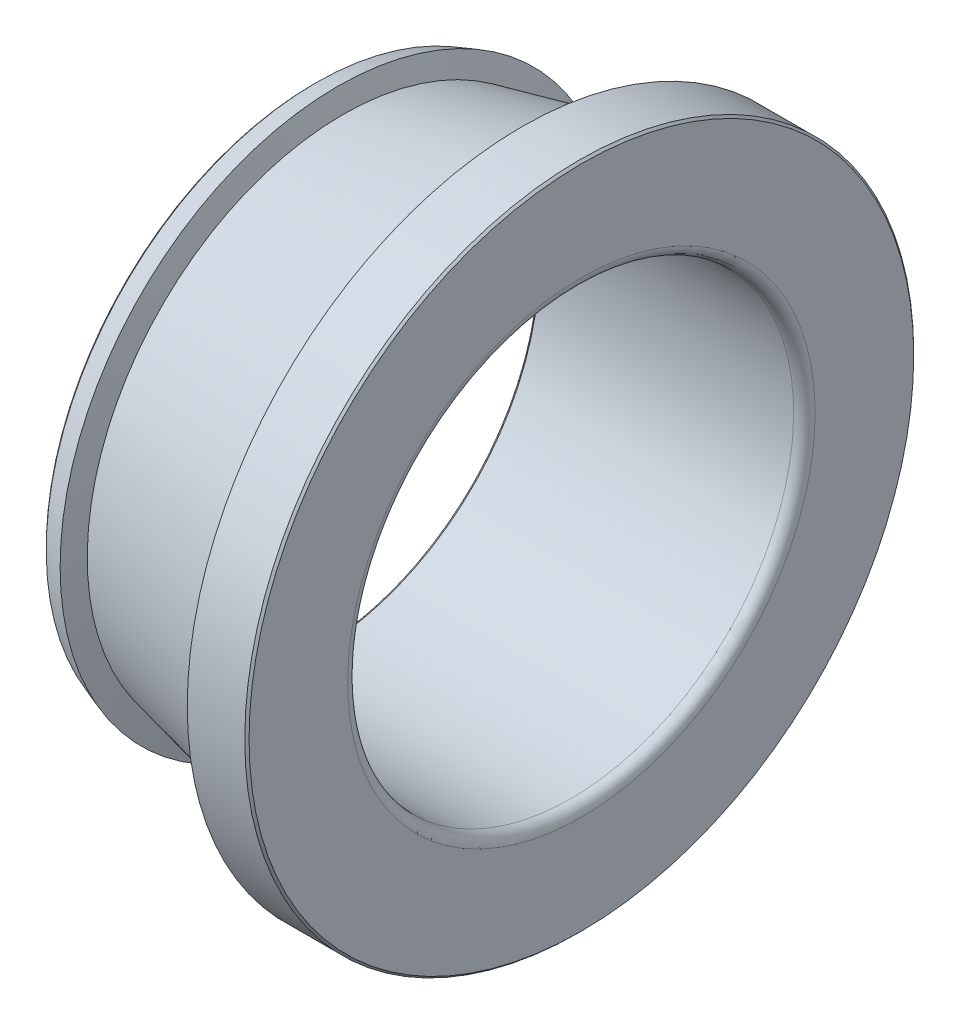
ISO-10303-21;
HEADER;
FILE_DESCRIPTION(('STEP AP214'),'2;1');
FILE_NAME('part.step','',(''),(''),'','','');
FILE_SCHEMA(('AUTOMOTIVE_DESIGN { 1 0 10303 214 1 1 1 1 }'));
ENDSEC;
DATA;
#1=APPLICATION_CONTEXT('core data for automotive mechanical design processes');
#2=APPLICATION_PROTOCOL_DEFINITION('international standard','automotive_design',2000,#1);
#3=PRODUCT_CONTEXT('',#1,'mechanical');
#4=PRODUCT('Part','Part','',(#3));
#5=PRODUCT_RELATED_PRODUCT_CATEGORY('part','',(#4));
#6=PRODUCT_DEFINITION_FORMATION('','',#4);
#7=PRODUCT_DEFINITION_CONTEXT('part definition',#1,'design');
#8=PRODUCT_DEFINITION('design','',#6,#7);
#9=PRODUCT_DEFINITION_SHAPE('','',#8);
#10=(LENGTH_UNIT() NAMED_UNIT(*) SI_UNIT(.MILLI.,.METRE.));
#11=(NAMED_UNIT(*) PLANE_ANGLE_UNIT() SI_UNIT($,.RADIAN.));
#12=(NAMED_UNIT(*) SI_UNIT($,.STERADIAN.) SOLID_ANGLE_UNIT());
#13=UNCERTAINTY_MEASURE_WITH_UNIT(LENGTH_MEASURE(1.E-05),#10,'distance_accuracy_value','');
#14=(GEOMETRIC_REPRESENTATION_CONTEXT(3) GLOBAL_UNCERTAINTY_ASSIGNED_CONTEXT((#13)) GLOBAL_UNIT_ASSIGNED_CONTEXT((#10,
#11,#12)) REPRESENTATION_CONTEXT('',''));
#15=CARTESIAN_POINT('',(0.,0.,0.));
#16=DIRECTION('',(0.,0.,1.));
#17=DIRECTION('',(1.,0.,0.));
#18=AXIS2_PLACEMENT_3D('',#15,#16,#17);
#19=CARTESIAN_POINT('',(5.235,0.,0.));
#20=DIRECTION('',(1.,0.,0.));
#21=DIRECTION('',(0.,1.,0.));
#22=AXIS2_PLACEMENT_3D('',#19,#20,#21);
#23=CONICAL_SURFACE('',#22,16.935,0.34097895349635);
#24=CARTESIAN_POINT('',(0.12,0.,0.));
#25=DIRECTION('',(1.,0.,0.));
#26=DIRECTION('',(0.,1.,0.));
#27=AXIS2_PLACEMENT_3D('',#24,#25,#26);
#28=CIRCLE('',#27,15.12);
#29=CARTESIAN_POINT('',(0.12,15.12,0.));
#30=VERTEX_POINT('',#29);
#31=EDGE_CURVE('E11',#30,#30,#28,.T.);
#32=ORIENTED_EDGE('',*,*,#31,.T.);
#33=EDGE_LOOP('',(#32));
#34=FACE_BOUND('',#33,.T.);
#35=CARTESIAN_POINT('',(1.32723454688479,0.,0.));
#36=DIRECTION('',(-1.,0.,0.));
#37=DIRECTION('',(0.,1.,0.));
#38=AXIS2_PLACEMENT_3D('',#35,#36,#37);
#39=CIRCLE('',#38,15.5483735488946);
#40=CARTESIAN_POINT('',(1.32723454688479,-15.5483735488946,0.));
#41=VERTEX_POINT('',#40);
#42=EDGE_CURVE('E65',#41,#41,#39,.T.);
#43=ORIENTED_EDGE('',*,*,#42,.T.);
#44=EDGE_LOOP('',(#43));
#45=FACE_BOUND('',#44,.T.);
#46=ADVANCED_FACE('F17',(#34,#45),#23,.T.);
#47=CARTESIAN_POINT('',(0.06,0.,0.));
#48=DIRECTION('',(1.,0.,0.));
#49=DIRECTION('',(0.,1.,0.));
#50=AXIS2_PLACEMENT_3D('',#47,#48,#49);
#51=CONICAL_SURFACE('',#50,15.06,0.785398163397445);
#52=CARTESIAN_POINT('',(0.,0.,0.));
#53=DIRECTION('',(1.,0.,0.));
#54=DIRECTION('',(0.,1.,0.));
#55=AXIS2_PLACEMENT_3D('',#52,#53,#54);
#56=CIRCLE('',#55,15.);
#57=CARTESIAN_POINT('',(0.,15.,0.));
#58=VERTEX_POINT('',#57);
#59=EDGE_CURVE('E20',#58,#58,#56,.T.);
#60=ORIENTED_EDGE('',*,*,#59,.T.);
#61=EDGE_LOOP('',(#60));
#62=FACE_BOUND('',#61,.T.);
#63=ORIENTED_EDGE('',*,*,#31,.F.);
#64=EDGE_LOOP('',(#63));
#65=FACE_BOUND('',#64,.T.);
#66=ADVANCED_FACE('F108',(#62,#65),#51,.T.);
#67=CARTESIAN_POINT('',(0.,13.81,0.));
#68=DIRECTION('',(-1.,0.,0.));
#69=DIRECTION('',(0.,-1.,0.));
#70=AXIS2_PLACEMENT_3D('',#67,#68,#69);
#71=PLANE('',#70);
#72=CARTESIAN_POINT('',(0.,0.,0.));
#73=DIRECTION('',(1.,0.,0.));
#74=DIRECTION('',(0.,1.,0.));
#75=AXIS2_PLACEMENT_3D('',#72,#73,#74);
#76=CIRCLE('',#75,12.62);
#77=CARTESIAN_POINT('',(0.,12.62,0.));
#78=VERTEX_POINT('',#77);
#79=EDGE_CURVE('E49',#78,#78,#76,.T.);
#80=ORIENTED_EDGE('',*,*,#79,.T.);
#81=EDGE_LOOP('',(#80));
#82=FACE_BOUND('',#81,.T.);
#83=ORIENTED_EDGE('',*,*,#59,.F.);
#84=EDGE_LOOP('',(#83));
#85=FACE_BOUND('',#84,.T.);
#86=ADVANCED_FACE('F112',(#82,#85),#71,.T.);
#87=CARTESIAN_POINT('',(0.12,0.,0.));
#88=DIRECTION('',(1.,0.,0.));
#89=DIRECTION('',(0.,0.,-1.));
#90=AXIS2_PLACEMENT_3D('',#87,#88,#89);
#91=TOROIDAL_SURFACE('',#90,12.62,0.12);
#92=CARTESIAN_POINT('',(0.12,0.,0.));
#93=DIRECTION('',(1.,0.,0.));
#94=DIRECTION('',(0.,1.,0.));
#95=AXIS2_PLACEMENT_3D('',#92,#93,#94);
#96=CIRCLE('',#95,12.5);
#97=CARTESIAN_POINT('',(0.12,12.5,0.));
#98=VERTEX_POINT('',#97);
#99=EDGE_CURVE('E54',#98,#98,#96,.T.);
#100=ORIENTED_EDGE('',*,*,#99,.T.);
#101=EDGE_LOOP('',(#100));
#102=FACE_BOUND('',#101,.T.);
#103=ORIENTED_EDGE('',*,*,#79,.F.);
#104=EDGE_LOOP('',(#103));
#105=FACE_BOUND('',#104,.T.);
#106=ADVANCED_FACE('F117',(#102,#105),#91,.T.);
#107=CARTESIAN_POINT('',(7.26,0.,0.));
#108=DIRECTION('',(-1.,0.,0.));
#109=DIRECTION('',(0.,1.,0.));
#110=AXIS2_PLACEMENT_3D('',#107,#108,#109);
#111=CYLINDRICAL_SURFACE('',#110,12.5);
#112=CARTESIAN_POINT('',(14.4,0.,0.));
#113=DIRECTION('',(1.,0.,0.));
#114=DIRECTION('',(0.,1.,0.));
#115=AXIS2_PLACEMENT_3D('',#112,#113,#114);
#116=CIRCLE('',#115,12.5);
#117=CARTESIAN_POINT('',(14.4,12.5,0.));
#118=VERTEX_POINT('',#117);
#119=EDGE_CURVE('E82',#118,#118,#116,.T.);
#120=ORIENTED_EDGE('',*,*,#119,.T.);
#121=EDGE_LOOP('',(#120));
#122=FACE_BOUND('',#121,.T.);
#123=ORIENTED_EDGE('',*,*,#99,.F.);
#124=EDGE_LOOP('',(#123));
#125=FACE_BOUND('',#124,.T.);
#126=ADVANCED_FACE('F123',(#122,#125),#111,.F.);
#127=CARTESIAN_POINT('',(14.4,0.,0.));
#128=DIRECTION('',(1.,0.,0.));
#129=DIRECTION('',(0.,0.,-1.));
#130=AXIS2_PLACEMENT_3D('',#127,#128,#129);
#131=TOROIDAL_SURFACE('',#130,13.1,0.6);
#132=CARTESIAN_POINT('',(15.,0.,0.));
#133=DIRECTION('',(1.,0.,0.));
#134=DIRECTION('',(0.,1.,0.));
#135=AXIS2_PLACEMENT_3D('',#132,#133,#134);
#136=CIRCLE('',#135,13.1);
#137=CARTESIAN_POINT('',(15.,13.1,0.));
#138=VERTEX_POINT('',#137);
#139=EDGE_CURVE('E80',#138,#138,#136,.T.);
#140=ORIENTED_EDGE('',*,*,#139,.T.);
#141=EDGE_LOOP('',(#140));
#142=FACE_BOUND('',#141,.T.);
#143=ORIENTED_EDGE('',*,*,#119,.F.);
#144=EDGE_LOOP('',(#143));
#145=FACE_BOUND('',#144,.T.);
#146=ADVANCED_FACE('F126',(#142,#145),#131,.T.);
#147=CARTESIAN_POINT('',(15.,15.865,0.));
#148=DIRECTION('',(1.,0.,0.));
#149=DIRECTION('',(0.,1.,0.));
#150=AXIS2_PLACEMENT_3D('',#147,#148,#149);
#151=PLANE('',#150);
#152=CARTESIAN_POINT('',(15.,0.,0.));
#153=DIRECTION('',(1.,0.,0.));
#154=DIRECTION('',(0.,1.,0.));
#155=AXIS2_PLACEMENT_3D('',#152,#153,#154);
#156=CIRCLE('',#155,18.63);
#157=CARTESIAN_POINT('',(15.,18.63,0.));
#158=VERTEX_POINT('',#157);
#159=EDGE_CURVE('E74',#158,#158,#156,.T.);
#160=ORIENTED_EDGE('',*,*,#159,.T.);
#161=EDGE_LOOP('',(#160));
#162=FACE_BOUND('',#161,.T.);
#163=ORIENTED_EDGE('',*,*,#139,.F.);
#164=EDGE_LOOP('',(#163));
#165=FACE_BOUND('',#164,.T.);
#166=ADVANCED_FACE('F130',(#162,#165),#151,.T.);
#167=CARTESIAN_POINT('',(14.94,0.,0.));
#168=DIRECTION('',(-1.,0.,0.));
#169=DIRECTION('',(0.,1.,0.));
#170=AXIS2_PLACEMENT_3D('',#167,#168,#169);
#171=CONICAL_SURFACE('',#170,18.69,0.785398163397456);
#172=CARTESIAN_POINT('',(14.88,0.,0.));
#173=DIRECTION('',(1.,0.,0.));
#174=DIRECTION('',(0.,1.,0.));
#175=AXIS2_PLACEMENT_3D('',#172,#173,#174);
#176=CIRCLE('',#175,18.75);
#177=CARTESIAN_POINT('',(14.88,18.75,0.));
#178=VERTEX_POINT('',#177);
#179=EDGE_CURVE('E72',#178,#178,#176,.T.);
#180=ORIENTED_EDGE('',*,*,#179,.T.);
#181=EDGE_LOOP('',(#180));
#182=FACE_BOUND('',#181,.T.);
#183=ORIENTED_EDGE('',*,*,#159,.F.);
#184=EDGE_LOOP('',(#183));
#185=FACE_BOUND('',#184,.T.);
#186=ADVANCED_FACE('F134',(#182,#185),#171,.T.);
#187=CARTESIAN_POINT('',(12.615,0.,0.));
#188=DIRECTION('',(-1.,0.,0.));
#189=DIRECTION('',(0.,1.,0.));
#190=AXIS2_PLACEMENT_3D('',#187,#188,#189);
#191=CYLINDRICAL_SURFACE('',#190,18.75);
#192=ORIENTED_EDGE('',*,*,#179,.F.);
#193=EDGE_LOOP('',(#192));
#194=FACE_BOUND('',#193,.T.);
#195=CARTESIAN_POINT('',(11.6555040033492,0.,0.));
#196=DIRECTION('',(1.,0.,0.));
#197=DIRECTION('',(0.,1.,0.));
#198=AXIS2_PLACEMENT_3D('',#195,#196,#197);
#199=CIRCLE('',#198,18.75);
#200=CARTESIAN_POINT('',(11.6555040033492,-18.75,0.));
#201=VERTEX_POINT('',#200);
#202=EDGE_CURVE('E69',#201,#201,#199,.T.);
#203=ORIENTED_EDGE('',*,*,#202,.T.);
#204=EDGE_LOOP('',(#203));
#205=FACE_BOUND('',#204,.T.);
#206=ADVANCED_FACE('F70',(#194,#205),#191,.T.);
#207=CARTESIAN_POINT('',(11.5146922961023,0.,0.));
#208=DIRECTION('',(-1.,0.,0.));
#209=DIRECTION('',(0.,1.,0.));
#210=AXIS2_PLACEMENT_3D('',#207,#208,#209);
#211=CONICAL_SURFACE('',#210,19.2984253906902,1.31946891450771);
#212=CARTESIAN_POINT('',(12.1737204970892,0.,0.));
#213=DIRECTION('',(1.,0.,0.));
#214=DIRECTION('',(0.,1.,0.));
#215=AXIS2_PLACEMENT_3D('',#212,#213,#214);
#216=CIRCLE('',#215,16.7316800136993);
#217=CARTESIAN_POINT('',(12.1737204970892,16.7316800136993,0.));
#218=VERTEX_POINT('',#217);
#219=EDGE_CURVE('E76',#218,#218,#216,.T.);
#220=ORIENTED_EDGE('',*,*,#219,.T.);
#221=EDGE_LOOP('',(#220));
#222=FACE_BOUND('',#221,.T.);
#223=ORIENTED_EDGE('',*,*,#202,.F.);
#224=EDGE_LOOP('',(#223));
#225=FACE_BOUND('',#224,.T.);
#226=ADVANCED_FACE('F97',(#222,#225),#211,.F.);
#227=CARTESIAN_POINT('',(1.05399415591312,0.,0.));
#228=DIRECTION('',(-1.,0.,0.));
#229=DIRECTION('',(0.,1.,0.));
#230=AXIS2_PLACEMENT_3D('',#227,#228,#229);
#231=CONICAL_SURFACE('',#230,16.6125746093098,1.31946891450771);
#232=CARTESIAN_POINT('',(1.6379997515314,0.,0.));
#233=DIRECTION('',(1.,0.,0.));
#234=DIRECTION('',(0.,1.,0.));
#235=AXIS2_PLACEMENT_3D('',#232,#233,#234);
#236=CIRCLE('',#235,14.3380229885364);
#237=CARTESIAN_POINT('',(1.6379997515314,14.3380229885364,0.));
#238=VERTEX_POINT('',#237);
#239=EDGE_CURVE('E85',#238,#238,#236,.T.);
#240=ORIENTED_EDGE('',*,*,#239,.F.);
#241=EDGE_LOOP('',(#240));
#242=FACE_BOUND('',#241,.T.);
#243=ORIENTED_EDGE('',*,*,#42,.F.);
#244=EDGE_LOOP('',(#243));
#245=FACE_BOUND('',#244,.T.);
#246=ADVANCED_FACE('F94',(#242,#245),#231,.T.);
#247=CARTESIAN_POINT('',(6.9058601243103,0.,0.));
#248=DIRECTION('',(1.,0.,0.));
#249=DIRECTION('',(0.,1.,0.));
#250=AXIS2_PLACEMENT_3D('',#247,#248,#249);
#251=CONICAL_SURFACE('',#250,15.5348515011179,0.223402144255273);
#252=ORIENTED_EDGE('',*,*,#219,.F.);
#253=EDGE_LOOP('',(#252));
#254=FACE_BOUND('',#253,.T.);
#255=ORIENTED_EDGE('',*,*,#239,.T.);
#256=EDGE_LOOP('',(#255));
#257=FACE_BOUND('',#256,.T.);
#258=ADVANCED_FACE('F92',(#254,#257),#251,.T.);
#259=CLOSED_SHELL('',(#46,#66,#86,#106,#126,#146,#166,#186,#206,#226,#246,#258));
#260=MANIFOLD_SOLID_BREP('B1',#259);
#261=ADVANCED_BREP_SHAPE_REPRESENTATION('',(#18,#260),#14);
#262=SHAPE_DEFINITION_REPRESENTATION(#9,#261);
ENDSEC;
END-ISO-10303-21;
